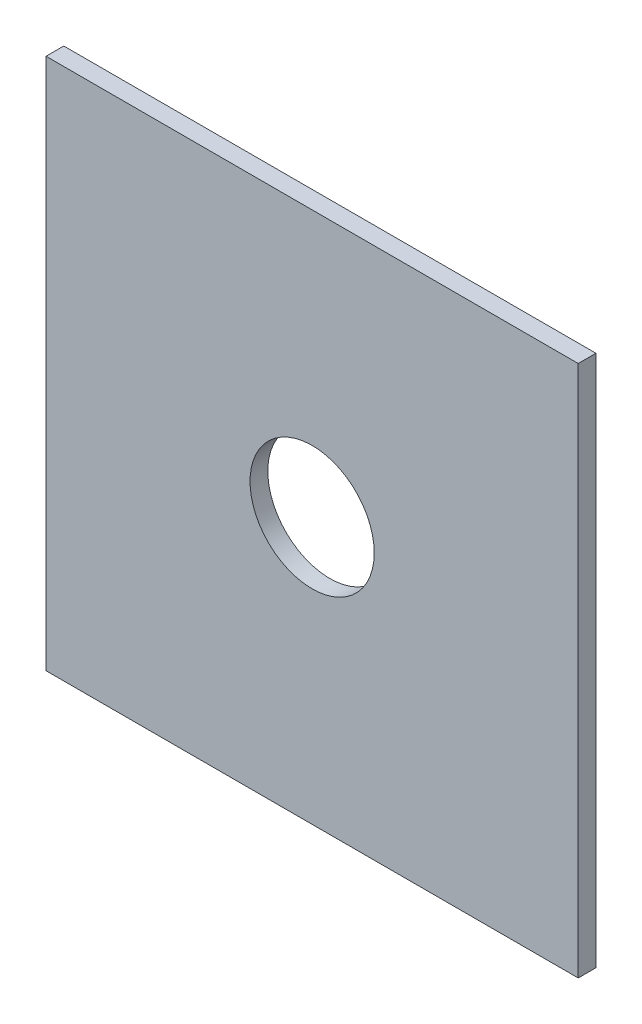
ISO-10303-21;
HEADER;
FILE_DESCRIPTION(('STEP AP214'),'2;1');
FILE_NAME('part.step','',(''),(''),'','','');
FILE_SCHEMA(('AUTOMOTIVE_DESIGN { 1 0 10303 214 1 1 1 1 }'));
ENDSEC;
DATA;
#1=APPLICATION_CONTEXT('core data for automotive mechanical design processes');
#2=APPLICATION_PROTOCOL_DEFINITION('international standard','automotive_design',2000,#1);
#3=PRODUCT_CONTEXT('',#1,'mechanical');
#4=PRODUCT('Part','Part','',(#3));
#5=PRODUCT_RELATED_PRODUCT_CATEGORY('part','',(#4));
#6=PRODUCT_DEFINITION_FORMATION('','',#4);
#7=PRODUCT_DEFINITION_CONTEXT('part definition',#1,'design');
#8=PRODUCT_DEFINITION('design','',#6,#7);
#9=PRODUCT_DEFINITION_SHAPE('','',#8);
#10=(LENGTH_UNIT() NAMED_UNIT(*) SI_UNIT(.MILLI.,.METRE.));
#11=(NAMED_UNIT(*) PLANE_ANGLE_UNIT() SI_UNIT($,.RADIAN.));
#12=(NAMED_UNIT(*) SI_UNIT($,.STERADIAN.) SOLID_ANGLE_UNIT());
#13=UNCERTAINTY_MEASURE_WITH_UNIT(LENGTH_MEASURE(1.E-05),#10,'distance_accuracy_value','');
#14=(GEOMETRIC_REPRESENTATION_CONTEXT(3) GLOBAL_UNCERTAINTY_ASSIGNED_CONTEXT((#13)) GLOBAL_UNIT_ASSIGNED_CONTEXT((#10,
#11,#12)) REPRESENTATION_CONTEXT('',''));
#15=CARTESIAN_POINT('',(0.,0.,0.));
#16=DIRECTION('',(0.,0.,1.));
#17=DIRECTION('',(1.,0.,0.));
#18=AXIS2_PLACEMENT_3D('',#15,#16,#17);
#19=CARTESIAN_POINT('',(7.5,7.5,0.5));
#20=DIRECTION('',(-1.,0.,0.));
#21=DIRECTION('',(0.,-1.,0.));
#22=AXIS2_PLACEMENT_3D('',#19,#20,#21);
#23=PLANE('',#22);
#24=DIRECTION('',(0.,1.,0.));
#25=VECTOR('',#24,1.);
#26=CARTESIAN_POINT('',(7.5,7.5,0.));
#27=LINE('',#26,#25);
#28=CARTESIAN_POINT('',(7.5,-7.5,0.));
#29=VERTEX_POINT('',#28);
#30=CARTESIAN_POINT('',(7.5,7.5,0.));
#31=VERTEX_POINT('',#30);
#32=EDGE_CURVE('E113',#29,#31,#27,.T.);
#33=ORIENTED_EDGE('',*,*,#32,.T.);
#34=DIRECTION('',(0.,0.,-1.));
#35=VECTOR('',#34,1.);
#36=CARTESIAN_POINT('',(7.5,7.5,0.5));
#37=LINE('',#36,#35);
#38=CARTESIAN_POINT('',(7.5,7.5,0.5));
#39=VERTEX_POINT('',#38);
#40=EDGE_CURVE('E11',#39,#31,#37,.T.);
#41=ORIENTED_EDGE('',*,*,#40,.F.);
#42=DIRECTION('',(0.,1.,0.));
#43=VECTOR('',#42,1.);
#44=CARTESIAN_POINT('',(7.5,7.5,0.5));
#45=LINE('',#44,#43);
#46=CARTESIAN_POINT('',(7.5,-7.5,0.5));
#47=VERTEX_POINT('',#46);
#48=EDGE_CURVE('E97',#47,#39,#45,.T.);
#49=ORIENTED_EDGE('',*,*,#48,.F.);
#50=DIRECTION('',(0.,0.,-1.));
#51=VECTOR('',#50,1.);
#52=CARTESIAN_POINT('',(7.5,-7.5,0.5));
#53=LINE('',#52,#51);
#54=EDGE_CURVE('E109',#47,#29,#53,.T.);
#55=ORIENTED_EDGE('',*,*,#54,.T.);
#56=EDGE_LOOP('',(#33,#41,#49,#55));
#57=FACE_BOUND('',#56,.T.);
#58=ADVANCED_FACE('F45',(#57),#23,.F.);
#59=CARTESIAN_POINT('',(-7.5,7.5,0.5));
#60=DIRECTION('',(0.,-1.,0.));
#61=DIRECTION('',(0.,0.,-1.));
#62=AXIS2_PLACEMENT_3D('',#59,#60,#61);
#63=PLANE('',#62);
#64=DIRECTION('',(-1.,0.,0.));
#65=VECTOR('',#64,1.);
#66=CARTESIAN_POINT('',(-7.5,7.5,0.));
#67=LINE('',#66,#65);
#68=CARTESIAN_POINT('',(-7.5,7.5,0.));
#69=VERTEX_POINT('',#68);
#70=EDGE_CURVE('E102',#31,#69,#67,.T.);
#71=ORIENTED_EDGE('',*,*,#70,.T.);
#72=DIRECTION('',(0.,0.,-1.));
#73=VECTOR('',#72,1.);
#74=CARTESIAN_POINT('',(-7.5,7.5,0.5));
#75=LINE('',#74,#73);
#76=CARTESIAN_POINT('',(-7.5,7.5,0.5));
#77=VERTEX_POINT('',#76);
#78=EDGE_CURVE('E54',#77,#69,#75,.T.);
#79=ORIENTED_EDGE('',*,*,#78,.F.);
#80=DIRECTION('',(-1.,0.,0.));
#81=VECTOR('',#80,1.);
#82=CARTESIAN_POINT('',(-7.5,7.5,0.5));
#83=LINE('',#82,#81);
#84=EDGE_CURVE('E92',#39,#77,#83,.T.);
#85=ORIENTED_EDGE('',*,*,#84,.F.);
#86=ORIENTED_EDGE('',*,*,#40,.T.);
#87=EDGE_LOOP('',(#71,#79,#85,#86));
#88=FACE_BOUND('',#87,.T.);
#89=ADVANCED_FACE('F101',(#88),#63,.F.);
#90=CARTESIAN_POINT('',(-7.5,7.5,0.5));
#91=DIRECTION('',(1.,0.,0.));
#92=DIRECTION('',(0.,1.,0.));
#93=AXIS2_PLACEMENT_3D('',#90,#91,#92);
#94=PLANE('',#93);
#95=DIRECTION('',(0.,-1.,0.));
#96=VECTOR('',#95,1.);
#97=CARTESIAN_POINT('',(-7.5,7.5,0.));
#98=LINE('',#97,#96);
#99=CARTESIAN_POINT('',(-7.5,-7.5,0.));
#100=VERTEX_POINT('',#99);
#101=EDGE_CURVE('E79',#69,#100,#98,.T.);
#102=ORIENTED_EDGE('',*,*,#101,.T.);
#103=DIRECTION('',(0.,0.,-1.));
#104=VECTOR('',#103,1.);
#105=CARTESIAN_POINT('',(-7.5,-7.5,0.5));
#106=LINE('',#105,#104);
#107=CARTESIAN_POINT('',(-7.5,-7.5,0.5));
#108=VERTEX_POINT('',#107);
#109=EDGE_CURVE('E104',#108,#100,#106,.T.);
#110=ORIENTED_EDGE('',*,*,#109,.F.);
#111=DIRECTION('',(0.,-1.,0.));
#112=VECTOR('',#111,1.);
#113=CARTESIAN_POINT('',(-7.5,7.5,0.5));
#114=LINE('',#113,#112);
#115=EDGE_CURVE('E95',#77,#108,#114,.T.);
#116=ORIENTED_EDGE('',*,*,#115,.F.);
#117=ORIENTED_EDGE('',*,*,#78,.T.);
#118=EDGE_LOOP('',(#102,#110,#116,#117));
#119=FACE_BOUND('',#118,.T.);
#120=ADVANCED_FACE('F105',(#119),#94,.F.);
#121=CARTESIAN_POINT('',(-7.5,-7.5,0.5));
#122=DIRECTION('',(0.,1.,0.));
#123=DIRECTION('',(0.,0.,1.));
#124=AXIS2_PLACEMENT_3D('',#121,#122,#123);
#125=PLANE('',#124);
#126=DIRECTION('',(1.,0.,0.));
#127=VECTOR('',#126,1.);
#128=CARTESIAN_POINT('',(-7.5,-7.5,0.));
#129=LINE('',#128,#127);
#130=EDGE_CURVE('E85',#100,#29,#129,.T.);
#131=ORIENTED_EDGE('',*,*,#130,.T.);
#132=ORIENTED_EDGE('',*,*,#54,.F.);
#133=DIRECTION('',(1.,0.,0.));
#134=VECTOR('',#133,1.);
#135=CARTESIAN_POINT('',(-7.5,-7.5,0.5));
#136=LINE('',#135,#134);
#137=EDGE_CURVE('E62',#108,#47,#136,.T.);
#138=ORIENTED_EDGE('',*,*,#137,.F.);
#139=ORIENTED_EDGE('',*,*,#109,.T.);
#140=EDGE_LOOP('',(#131,#132,#138,#139));
#141=FACE_BOUND('',#140,.T.);
#142=ADVANCED_FACE('F127',(#141),#125,.F.);
#143=CARTESIAN_POINT('',(0.,0.,0.5));
#144=DIRECTION('',(0.,0.,1.));
#145=DIRECTION('',(1.,0.,0.));
#146=AXIS2_PLACEMENT_3D('',#143,#144,#145);
#147=PLANE('',#146);
#148=CARTESIAN_POINT('',(0.,0.,0.5));
#149=DIRECTION('',(0.,0.,1.));
#150=DIRECTION('',(1.,0.,0.));
#151=AXIS2_PLACEMENT_3D('',#148,#149,#150);
#152=CIRCLE('',#151,1.75);
#153=CARTESIAN_POINT('',(1.75,0.,0.5));
#154=VERTEX_POINT('',#153);
#155=EDGE_CURVE('E134',#154,#154,#152,.T.);
#156=ORIENTED_EDGE('',*,*,#155,.F.);
#157=EDGE_LOOP('',(#156));
#158=FACE_BOUND('',#157,.T.);
#159=ORIENTED_EDGE('',*,*,#48,.T.);
#160=ORIENTED_EDGE('',*,*,#84,.T.);
#161=ORIENTED_EDGE('',*,*,#115,.T.);
#162=ORIENTED_EDGE('',*,*,#137,.T.);
#163=EDGE_LOOP('',(#159,#160,#161,#162));
#164=FACE_BOUND('',#163,.T.);
#165=ADVANCED_FACE('F93',(#158,#164),#147,.T.);
#166=CARTESIAN_POINT('',(0.,0.,0.));
#167=DIRECTION('',(0.,0.,1.));
#168=DIRECTION('',(1.,0.,0.));
#169=AXIS2_PLACEMENT_3D('',#166,#167,#168);
#170=PLANE('',#169);
#171=CARTESIAN_POINT('',(0.,0.,0.));
#172=DIRECTION('',(0.,0.,1.));
#173=DIRECTION('',(1.,0.,0.));
#174=AXIS2_PLACEMENT_3D('',#171,#172,#173);
#175=CIRCLE('',#174,1.75);
#176=CARTESIAN_POINT('',(1.75,0.,0.));
#177=VERTEX_POINT('',#176);
#178=EDGE_CURVE('E117',#177,#177,#175,.T.);
#179=ORIENTED_EDGE('',*,*,#178,.T.);
#180=EDGE_LOOP('',(#179));
#181=FACE_BOUND('',#180,.T.);
#182=ORIENTED_EDGE('',*,*,#32,.F.);
#183=ORIENTED_EDGE('',*,*,#130,.F.);
#184=ORIENTED_EDGE('',*,*,#101,.F.);
#185=ORIENTED_EDGE('',*,*,#70,.F.);
#186=EDGE_LOOP('',(#182,#183,#184,#185));
#187=FACE_BOUND('',#186,.T.);
#188=ADVANCED_FACE('F130',(#181,#187),#170,.F.);
#189=CARTESIAN_POINT('',(0.,0.,0.));
#190=DIRECTION('',(0.,0.,1.));
#191=DIRECTION('',(1.,0.,0.));
#192=AXIS2_PLACEMENT_3D('',#189,#190,#191);
#193=CYLINDRICAL_SURFACE('',#192,1.75);
#194=ORIENTED_EDGE('',*,*,#178,.F.);
#195=EDGE_LOOP('',(#194));
#196=FACE_BOUND('',#195,.T.);
#197=ORIENTED_EDGE('',*,*,#155,.T.);
#198=EDGE_LOOP('',(#197));
#199=FACE_BOUND('',#198,.T.);
#200=ADVANCED_FACE('F143',(#196,#199),#193,.F.);
#201=CLOSED_SHELL('',(#58,#89,#120,#142,#165,#188,#200));
#202=MANIFOLD_SOLID_BREP('B2',#201);
#203=ADVANCED_BREP_SHAPE_REPRESENTATION('',(#18,#202),#14);
#204=SHAPE_DEFINITION_REPRESENTATION(#9,#203);
ENDSEC;
END-ISO-10303-21;
